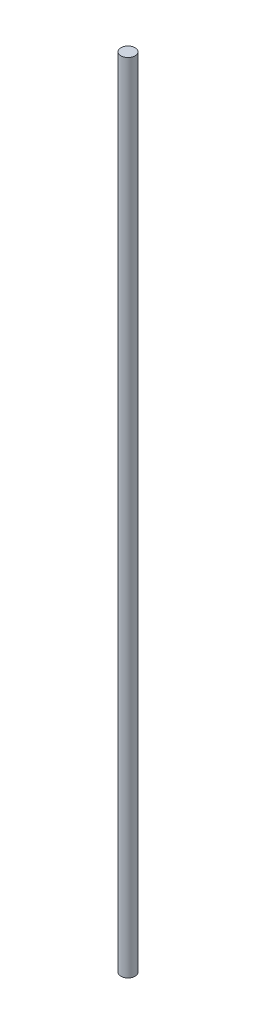
ISO-10303-21;
HEADER;
FILE_DESCRIPTION(('STEP AP214'),'2;1');
FILE_NAME('part.step','',(''),(''),'','','');
FILE_SCHEMA(('AUTOMOTIVE_DESIGN { 1 0 10303 214 1 1 1 1 }'));
ENDSEC;
DATA;
#1=APPLICATION_CONTEXT('core data for automotive mechanical design processes');
#2=APPLICATION_PROTOCOL_DEFINITION('international standard','automotive_design',2000,#1);
#3=PRODUCT_CONTEXT('',#1,'mechanical');
#4=PRODUCT('Part','Part','',(#3));
#5=PRODUCT_RELATED_PRODUCT_CATEGORY('part','',(#4));
#6=PRODUCT_DEFINITION_FORMATION('','',#4);
#7=PRODUCT_DEFINITION_CONTEXT('part definition',#1,'design');
#8=PRODUCT_DEFINITION('design','',#6,#7);
#9=PRODUCT_DEFINITION_SHAPE('','',#8);
#10=(LENGTH_UNIT() NAMED_UNIT(*) SI_UNIT(.MILLI.,.METRE.));
#11=(NAMED_UNIT(*) PLANE_ANGLE_UNIT() SI_UNIT($,.RADIAN.));
#12=(NAMED_UNIT(*) SI_UNIT($,.STERADIAN.) SOLID_ANGLE_UNIT());
#13=UNCERTAINTY_MEASURE_WITH_UNIT(LENGTH_MEASURE(1.E-05),#10,'distance_accuracy_value','');
#14=(GEOMETRIC_REPRESENTATION_CONTEXT(3) GLOBAL_UNCERTAINTY_ASSIGNED_CONTEXT((#13)) GLOBAL_UNIT_ASSIGNED_CONTEXT((#10,
#11,#12)) REPRESENTATION_CONTEXT('',''));
#15=CARTESIAN_POINT('',(0.,0.,0.));
#16=DIRECTION('',(0.,0.,1.));
#17=DIRECTION('',(1.,0.,0.));
#18=AXIS2_PLACEMENT_3D('',#15,#16,#17);
#19=CARTESIAN_POINT('',(0.,355.6,0.));
#20=DIRECTION('',(0.,-1.,0.));
#21=DIRECTION('',(0.,0.,-1.));
#22=AXIS2_PLACEMENT_3D('',#19,#20,#21);
#23=CYLINDRICAL_SURFACE('',#22,3.15);
#24=CARTESIAN_POINT('',(0.,355.6,0.));
#25=DIRECTION('',(0.,1.,0.));
#26=DIRECTION('',(0.,0.,1.));
#27=AXIS2_PLACEMENT_3D('',#24,#25,#26);
#28=CIRCLE('',#27,3.15);
#29=CARTESIAN_POINT('',(0.,355.6,3.15));
#30=VERTEX_POINT('',#29);
#31=EDGE_CURVE('E10',#30,#30,#28,.T.);
#32=ORIENTED_EDGE('',*,*,#31,.F.);
#33=EDGE_LOOP('',(#32));
#34=FACE_BOUND('',#33,.T.);
#35=CARTESIAN_POINT('',(0.,0.,0.));
#36=DIRECTION('',(0.,1.,0.));
#37=DIRECTION('',(0.,0.,1.));
#38=AXIS2_PLACEMENT_3D('',#35,#36,#37);
#39=CIRCLE('',#38,3.15);
#40=CARTESIAN_POINT('',(0.,0.,3.15));
#41=VERTEX_POINT('',#40);
#42=EDGE_CURVE('E34',#41,#41,#39,.T.);
#43=ORIENTED_EDGE('',*,*,#42,.T.);
#44=EDGE_LOOP('',(#43));
#45=FACE_BOUND('',#44,.T.);
#46=ADVANCED_FACE('F31',(#34,#45),#23,.T.);
#47=CARTESIAN_POINT('',(0.,355.6,0.));
#48=DIRECTION('',(0.,1.,0.));
#49=DIRECTION('',(0.,0.,1.));
#50=AXIS2_PLACEMENT_3D('',#47,#48,#49);
#51=PLANE('',#50);
#52=ORIENTED_EDGE('',*,*,#31,.T.);
#53=EDGE_LOOP('',(#52));
#54=FACE_BOUND('',#53,.T.);
#55=ADVANCED_FACE('F46',(#54),#51,.T.);
#56=CARTESIAN_POINT('',(0.,0.,0.));
#57=DIRECTION('',(0.,1.,0.));
#58=DIRECTION('',(0.,0.,1.));
#59=AXIS2_PLACEMENT_3D('',#56,#57,#58);
#60=PLANE('',#59);
#61=ORIENTED_EDGE('',*,*,#42,.F.);
#62=EDGE_LOOP('',(#61));
#63=FACE_BOUND('',#62,.T.);
#64=ADVANCED_FACE('F44',(#63),#60,.F.);
#65=CLOSED_SHELL('',(#46,#55,#64));
#66=MANIFOLD_SOLID_BREP('B2',#65);
#67=ADVANCED_BREP_SHAPE_REPRESENTATION('',(#18,#66),#14);
#68=SHAPE_DEFINITION_REPRESENTATION(#9,#67);
ENDSEC;
END-ISO-10303-21;
